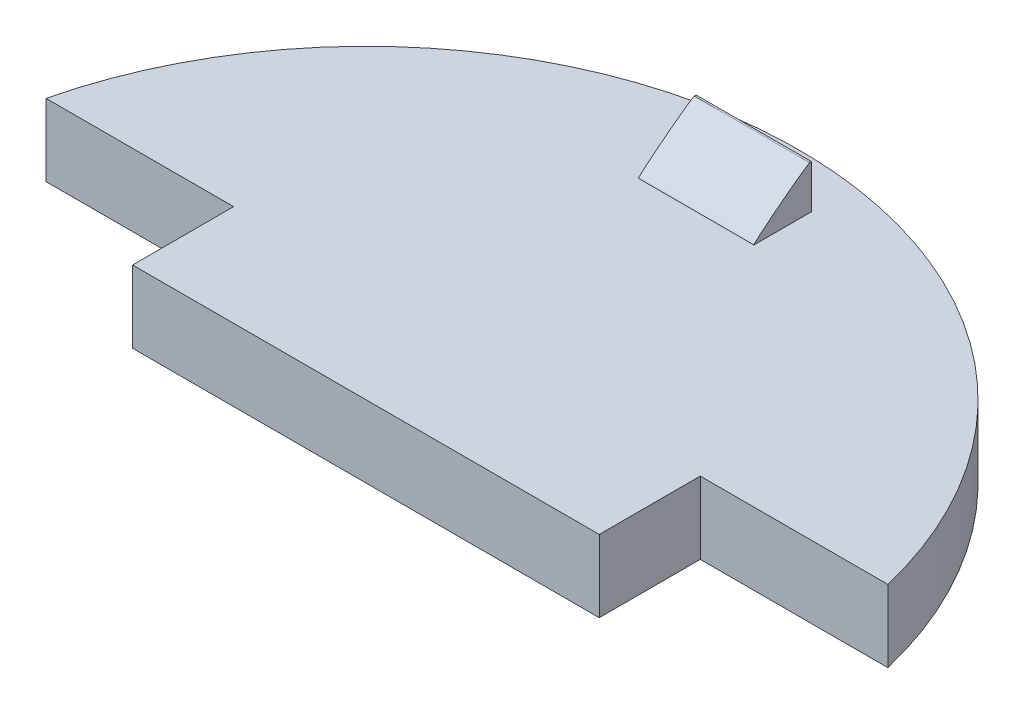
ISO-10303-21;
HEADER;
FILE_DESCRIPTION(('STEP AP214'),'2;1');
FILE_NAME('part.step','',(''),(''),'','','');
FILE_SCHEMA(('AUTOMOTIVE_DESIGN { 1 0 10303 214 1 1 1 1 }'));
ENDSEC;
DATA;
#1=APPLICATION_CONTEXT('core data for automotive mechanical design processes');
#2=APPLICATION_PROTOCOL_DEFINITION('international standard','automotive_design',2000,#1);
#3=PRODUCT_CONTEXT('',#1,'mechanical');
#4=PRODUCT('Part','Part','',(#3));
#5=PRODUCT_RELATED_PRODUCT_CATEGORY('part','',(#4));
#6=PRODUCT_DEFINITION_FORMATION('','',#4);
#7=PRODUCT_DEFINITION_CONTEXT('part definition',#1,'design');
#8=PRODUCT_DEFINITION('design','',#6,#7);
#9=PRODUCT_DEFINITION_SHAPE('','',#8);
#10=(LENGTH_UNIT() NAMED_UNIT(*) SI_UNIT(.MILLI.,.METRE.));
#11=(NAMED_UNIT(*) PLANE_ANGLE_UNIT() SI_UNIT($,.RADIAN.));
#12=(NAMED_UNIT(*) SI_UNIT($,.STERADIAN.) SOLID_ANGLE_UNIT());
#13=UNCERTAINTY_MEASURE_WITH_UNIT(LENGTH_MEASURE(1.E-05),#10,'distance_accuracy_value','');
#14=(GEOMETRIC_REPRESENTATION_CONTEXT(3) GLOBAL_UNCERTAINTY_ASSIGNED_CONTEXT((#13)) GLOBAL_UNIT_ASSIGNED_CONTEXT((#10,
#11,#12)) REPRESENTATION_CONTEXT('',''));
#15=CARTESIAN_POINT('',(0.,0.,0.));
#16=DIRECTION('',(0.,0.,1.));
#17=DIRECTION('',(1.,0.,0.));
#18=AXIS2_PLACEMENT_3D('',#15,#16,#17);
#19=CARTESIAN_POINT('',(0.,5.,0.));
#20=DIRECTION('',(0.,1.,0.));
#21=DIRECTION('',(0.,0.,1.));
#22=AXIS2_PLACEMENT_3D('',#19,#20,#21);
#23=PLANE('',#22);
#24=DIRECTION('',(-1.,0.,0.));
#25=VECTOR('',#24,1.);
#26=CARTESIAN_POINT('',(-16.1719042916297,5.,-7.));
#27=LINE('',#26,#25);
#28=CARTESIAN_POINT('',(-16.1719042916297,5.,-7.));
#29=VERTEX_POINT('',#28);
#30=CARTESIAN_POINT('',(-29.1719042916297,5.,-7.));
#31=VERTEX_POINT('',#30);
#32=EDGE_CURVE('E134',#29,#31,#27,.T.);
#33=ORIENTED_EDGE('',*,*,#32,.F.);
#34=DIRECTION('',(0.,0.,-1.));
#35=VECTOR('',#34,1.);
#36=CARTESIAN_POINT('',(-16.1719042916297,5.,0.));
#37=LINE('',#36,#35);
#38=CARTESIAN_POINT('',(-16.1719042916297,5.,0.));
#39=VERTEX_POINT('',#38);
#40=EDGE_CURVE('E126',#39,#29,#37,.T.);
#41=ORIENTED_EDGE('',*,*,#40,.F.);
#42=DIRECTION('',(1.,0.,0.));
#43=VECTOR('',#42,1.);
#44=CARTESIAN_POINT('',(-30.,5.,0.));
#45=LINE('',#44,#43);
#46=CARTESIAN_POINT('',(16.1719042916297,5.,0.));
#47=VERTEX_POINT('',#46);
#48=EDGE_CURVE('E140',#39,#47,#45,.T.);
#49=ORIENTED_EDGE('',*,*,#48,.T.);
#50=DIRECTION('',(0.,0.,1.));
#51=VECTOR('',#50,1.);
#52=CARTESIAN_POINT('',(16.1719042916297,5.,0.));
#53=LINE('',#52,#51);
#54=CARTESIAN_POINT('',(16.1719042916297,5.,-7.));
#55=VERTEX_POINT('',#54);
#56=EDGE_CURVE('E307',#55,#47,#53,.T.);
#57=ORIENTED_EDGE('',*,*,#56,.F.);
#58=DIRECTION('',(-1.,0.,0.));
#59=VECTOR('',#58,1.);
#60=CARTESIAN_POINT('',(16.1719042916297,5.,-7.));
#61=LINE('',#60,#59);
#62=CARTESIAN_POINT('',(29.1719042916297,5.,-7.));
#63=VERTEX_POINT('',#62);
#64=EDGE_CURVE('E304',#63,#55,#61,.T.);
#65=ORIENTED_EDGE('',*,*,#64,.F.);
#66=CARTESIAN_POINT('',(0.,5.,0.));
#67=DIRECTION('',(0.,1.,0.));
#68=DIRECTION('',(0.,0.,1.));
#69=AXIS2_PLACEMENT_3D('',#66,#67,#68);
#70=CIRCLE('',#69,30.);
#71=EDGE_CURVE('E149',#63,#31,#70,.T.);
#72=ORIENTED_EDGE('',*,*,#71,.T.);
#73=EDGE_LOOP('',(#33,#41,#49,#57,#65,#72));
#74=FACE_BOUND('',#73,.T.);
#75=DIRECTION('',(-1.,0.,0.));
#76=VECTOR('',#75,1.);
#77=CARTESIAN_POINT('',(-3.84159331598207,5.,-26.7316665793187));
#78=LINE('',#77,#76);
#79=CARTESIAN_POINT('',(4.15840668401793,5.,-26.7316665793187));
#80=VERTEX_POINT('',#79);
#81=CARTESIAN_POINT('',(-3.84159331598207,5.,-26.7316665793187));
#82=VERTEX_POINT('',#81);
#83=EDGE_CURVE('E183',#80,#82,#78,.T.);
#84=ORIENTED_EDGE('',*,*,#83,.F.);
#85=DIRECTION('',(0.,0.,-1.));
#86=VECTOR('',#85,1.);
#87=CARTESIAN_POINT('',(4.15840668401793,5.,-26.7316665793187));
#88=LINE('',#87,#86);
#89=CARTESIAN_POINT('',(4.15840668401793,5.,-22.7316665793187));
#90=VERTEX_POINT('',#89);
#91=EDGE_CURVE('E187',#90,#80,#88,.T.);
#92=ORIENTED_EDGE('',*,*,#91,.F.);
#93=CARTESIAN_POINT('',(-4.24159331598207,5.,-22.7316665793187));
#94=CARTESIAN_POINT('',(-1.30825998264874,5.,-22.7316665793187));
#95=CARTESIAN_POINT('',(1.6250733506846,5.,-22.7316665793187));
#96=CARTESIAN_POINT('',(4.55840668401793,5.,-22.7316665793187));
#97=(BOUNDED_CURVE() B_SPLINE_CURVE(3,(#93,#94,#95,#96),.UNSPECIFIED.,.F.,
.F.) B_SPLINE_CURVE_WITH_KNOTS((4,4),(-0.00455840668401793,0.00424159331598207),
.UNSPECIFIED.) CURVE() GEOMETRIC_REPRESENTATION_ITEM() RATIONAL_B_SPLINE_CURVE((1.,1.,1.,1.)) REPRESENTATION_ITEM(''));
#98=CARTESIAN_POINT('',(-3.84159331598207,5.,-22.7316665793187));
#99=VERTEX_POINT('',#98);
#100=EDGE_CURVE('E171',#99,#90,#97,.T.);
#101=ORIENTED_EDGE('',*,*,#100,.F.);
#102=DIRECTION('',(0.,0.,1.));
#103=VECTOR('',#102,1.);
#104=CARTESIAN_POINT('',(-3.84159331598207,5.,-26.7316665793187));
#105=LINE('',#104,#103);
#106=EDGE_CURVE('E186',#82,#99,#105,.T.);
#107=ORIENTED_EDGE('',*,*,#106,.F.);
#108=EDGE_LOOP('',(#84,#92,#101,#107));
#109=FACE_BOUND('',#108,.T.);
#110=ADVANCED_FACE('F43',(#74,#109),#23,.T.);
#111=CARTESIAN_POINT('',(0.,5.,0.));
#112=DIRECTION('',(0.,-1.,0.));
#113=DIRECTION('',(0.,0.,-1.));
#114=AXIS2_PLACEMENT_3D('',#111,#112,#113);
#115=CYLINDRICAL_SURFACE('',#114,30.);
#116=CARTESIAN_POINT('',(0.,0.,0.));
#117=DIRECTION('',(0.,1.,0.));
#118=DIRECTION('',(0.,0.,1.));
#119=AXIS2_PLACEMENT_3D('',#116,#117,#118);
#120=CIRCLE('',#119,30.);
#121=CARTESIAN_POINT('',(29.1719042916297,0.,-7.));
#122=VERTEX_POINT('',#121);
#123=CARTESIAN_POINT('',(-29.1719042916297,0.,-7.));
#124=VERTEX_POINT('',#123);
#125=EDGE_CURVE('E159',#122,#124,#120,.T.);
#126=ORIENTED_EDGE('',*,*,#125,.T.);
#127=DIRECTION('',(0.,1.,0.));
#128=VECTOR('',#127,1.);
#129=CARTESIAN_POINT('',(-29.1719042916297,-5.,-7.));
#130=LINE('',#129,#128);
#131=EDGE_CURVE('E207',#124,#31,#130,.T.);
#132=ORIENTED_EDGE('',*,*,#131,.T.);
#133=ORIENTED_EDGE('',*,*,#71,.F.);
#134=DIRECTION('',(0.,1.,0.));
#135=VECTOR('',#134,1.);
#136=CARTESIAN_POINT('',(29.1719042916297,-5.,-7.));
#137=LINE('',#136,#135);
#138=EDGE_CURVE('E178',#122,#63,#137,.T.);
#139=ORIENTED_EDGE('',*,*,#138,.F.);
#140=EDGE_LOOP('',(#126,#132,#133,#139));
#141=FACE_BOUND('',#140,.T.);
#142=ADVANCED_FACE('F278',(#141),#115,.T.);
#143=CARTESIAN_POINT('',(-30.,5.,0.));
#144=DIRECTION('',(0.,0.,-1.));
#145=DIRECTION('',(-1.,0.,0.));
#146=AXIS2_PLACEMENT_3D('',#143,#144,#145);
#147=PLANE('',#146);
#148=ORIENTED_EDGE('',*,*,#48,.F.);
#149=DIRECTION('',(0.,1.,0.));
#150=VECTOR('',#149,1.);
#151=CARTESIAN_POINT('',(-16.1719042916297,-5.,0.));
#152=LINE('',#151,#150);
#153=CARTESIAN_POINT('',(-16.1719042916297,0.,0.));
#154=VERTEX_POINT('',#153);
#155=EDGE_CURVE('E123',#154,#39,#152,.T.);
#156=ORIENTED_EDGE('',*,*,#155,.F.);
#157=DIRECTION('',(1.,0.,0.));
#158=VECTOR('',#157,1.);
#159=CARTESIAN_POINT('',(-30.,0.,0.));
#160=LINE('',#159,#158);
#161=CARTESIAN_POINT('',(16.1719042916297,0.,0.));
#162=VERTEX_POINT('',#161);
#163=EDGE_CURVE('E155',#154,#162,#160,.T.);
#164=ORIENTED_EDGE('',*,*,#163,.T.);
#165=DIRECTION('',(0.,1.,0.));
#166=VECTOR('',#165,1.);
#167=CARTESIAN_POINT('',(16.1719042916297,-5.,0.));
#168=LINE('',#167,#166);
#169=EDGE_CURVE('E143',#162,#47,#168,.T.);
#170=ORIENTED_EDGE('',*,*,#169,.T.);
#171=EDGE_LOOP('',(#148,#156,#164,#170));
#172=FACE_BOUND('',#171,.T.);
#173=ADVANCED_FACE('F146',(#172),#147,.F.);
#174=CARTESIAN_POINT('',(0.,0.,0.));
#175=DIRECTION('',(0.,1.,0.));
#176=DIRECTION('',(0.,0.,1.));
#177=AXIS2_PLACEMENT_3D('',#174,#175,#176);
#178=PLANE('',#177);
#179=DIRECTION('',(0.,0.,-1.));
#180=VECTOR('',#179,1.);
#181=CARTESIAN_POINT('',(-16.1719042916297,0.,0.));
#182=LINE('',#181,#180);
#183=CARTESIAN_POINT('',(-16.1719042916297,0.,-7.));
#184=VERTEX_POINT('',#183);
#185=EDGE_CURVE('E56',#154,#184,#182,.T.);
#186=ORIENTED_EDGE('',*,*,#185,.T.);
#187=DIRECTION('',(-1.,0.,0.));
#188=VECTOR('',#187,1.);
#189=CARTESIAN_POINT('',(0.,0.,-7.));
#190=LINE('',#189,#188);
#191=EDGE_CURVE('E12',#184,#124,#190,.T.);
#192=ORIENTED_EDGE('',*,*,#191,.T.);
#193=ORIENTED_EDGE('',*,*,#125,.F.);
#194=DIRECTION('',(-1.,0.,0.));
#195=VECTOR('',#194,1.);
#196=CARTESIAN_POINT('',(0.,0.,-7.));
#197=LINE('',#196,#195);
#198=CARTESIAN_POINT('',(16.1719042916297,0.,-7.));
#199=VERTEX_POINT('',#198);
#200=EDGE_CURVE('E267',#122,#199,#197,.T.);
#201=ORIENTED_EDGE('',*,*,#200,.T.);
#202=DIRECTION('',(0.,0.,1.));
#203=VECTOR('',#202,1.);
#204=CARTESIAN_POINT('',(16.1719042916297,0.,0.));
#205=LINE('',#204,#203);
#206=EDGE_CURVE('E317',#199,#162,#205,.T.);
#207=ORIENTED_EDGE('',*,*,#206,.T.);
#208=ORIENTED_EDGE('',*,*,#163,.F.);
#209=EDGE_LOOP('',(#186,#192,#193,#201,#207,#208));
#210=FACE_BOUND('',#209,.T.);
#211=ADVANCED_FACE('F281',(#210),#178,.F.);
#212=CARTESIAN_POINT('',(4.15840668401793,8.,-26.7316665793187));
#213=DIRECTION('',(-1.,0.,0.));
#214=DIRECTION('',(0.,0.,1.));
#215=AXIS2_PLACEMENT_3D('',#212,#213,#214);
#216=PLANE('',#215);
#217=DIRECTION('',(0.,0.,-1.));
#218=VECTOR('',#217,1.);
#219=CARTESIAN_POINT('',(4.15840668401793,8.,-26.7316665793187));
#220=LINE('',#219,#218);
#221=CARTESIAN_POINT('',(4.15840668401793,8.,-26.6046499255261));
#222=VERTEX_POINT('',#221);
#223=CARTESIAN_POINT('',(4.15840668401793,8.,-26.7316665793187));
#224=VERTEX_POINT('',#223);
#225=EDGE_CURVE('E166',#222,#224,#220,.T.);
#226=ORIENTED_EDGE('',*,*,#225,.F.);
#227=CARTESIAN_POINT('',(4.15840668401793,5.,-22.7316665793187));
#228=CARTESIAN_POINT('',(4.15840668401793,8.,-23.5062632485602));
#229=CARTESIAN_POINT('',(4.15840668401793,8.,-26.6046499255261));
#230=(BOUNDED_CURVE() B_SPLINE_CURVE(2,(#227,#228,#229),.UNSPECIFIED.,.F.,
.F.) B_SPLINE_CURVE_WITH_KNOTS((3,3),(0.,1.),
.UNSPECIFIED.) CURVE() GEOMETRIC_REPRESENTATION_ITEM() RATIONAL_B_SPLINE_CURVE((1.,
0.0574959574576069,1.)) REPRESENTATION_ITEM(''));
#231=EDGE_CURVE('E154',#222,#90,#230,.F.);
#232=ORIENTED_EDGE('',*,*,#231,.T.);
#233=ORIENTED_EDGE('',*,*,#91,.T.);
#234=DIRECTION('',(0.,-1.,0.));
#235=VECTOR('',#234,1.);
#236=CARTESIAN_POINT('',(4.15840668401793,8.,-26.7316665793187));
#237=LINE('',#236,#235);
#238=EDGE_CURVE('E163',#224,#80,#237,.T.);
#239=ORIENTED_EDGE('',*,*,#238,.F.);
#240=EDGE_LOOP('',(#226,#232,#233,#239));
#241=FACE_BOUND('',#240,.T.);
#242=ADVANCED_FACE('F202',(#241),#216,.F.);
#243=CARTESIAN_POINT('',(-3.84159331598207,8.,-26.7316665793187));
#244=DIRECTION('',(0.,0.,1.));
#245=DIRECTION('',(1.,0.,0.));
#246=AXIS2_PLACEMENT_3D('',#243,#244,#245);
#247=PLANE('',#246);
#248=ORIENTED_EDGE('',*,*,#83,.T.);
#249=DIRECTION('',(0.,-1.,0.));
#250=VECTOR('',#249,1.);
#251=CARTESIAN_POINT('',(-3.84159331598207,8.,-26.7316665793187));
#252=LINE('',#251,#250);
#253=CARTESIAN_POINT('',(-3.84159331598207,8.,-26.7316665793187));
#254=VERTEX_POINT('',#253);
#255=EDGE_CURVE('E188',#254,#82,#252,.T.);
#256=ORIENTED_EDGE('',*,*,#255,.F.);
#257=DIRECTION('',(-1.,0.,0.));
#258=VECTOR('',#257,1.);
#259=CARTESIAN_POINT('',(-3.84159331598207,8.,-26.7316665793187));
#260=LINE('',#259,#258);
#261=EDGE_CURVE('E170',#224,#254,#260,.T.);
#262=ORIENTED_EDGE('',*,*,#261,.F.);
#263=ORIENTED_EDGE('',*,*,#238,.T.);
#264=EDGE_LOOP('',(#248,#256,#262,#263));
#265=FACE_BOUND('',#264,.T.);
#266=ADVANCED_FACE('F196',(#265),#247,.F.);
#267=CARTESIAN_POINT('',(-3.84159331598207,8.,-26.7316665793187));
#268=DIRECTION('',(1.,0.,0.));
#269=DIRECTION('',(0.,0.,-1.));
#270=AXIS2_PLACEMENT_3D('',#267,#268,#269);
#271=PLANE('',#270);
#272=ORIENTED_EDGE('',*,*,#106,.T.);
#273=CARTESIAN_POINT('',(-3.84159331598207,8.,-26.6046499255261));
#274=CARTESIAN_POINT('',(-3.84159331598207,8.,-23.5062632485602));
#275=CARTESIAN_POINT('',(-3.84159331598207,5.,-22.7316665793187));
#276=(BOUNDED_CURVE() B_SPLINE_CURVE(2,(#273,#274,#275),.UNSPECIFIED.,.F.,
.F.) B_SPLINE_CURVE_WITH_KNOTS((3,3),(0.,1.),
.UNSPECIFIED.) CURVE() GEOMETRIC_REPRESENTATION_ITEM() RATIONAL_B_SPLINE_CURVE((1.,
0.0574959574576069,1.)) REPRESENTATION_ITEM(''));
#277=CARTESIAN_POINT('',(-3.84159331598207,8.,-26.6046499255261));
#278=VERTEX_POINT('',#277);
#279=EDGE_CURVE('E245',#99,#278,#276,.F.);
#280=ORIENTED_EDGE('',*,*,#279,.T.);
#281=DIRECTION('',(0.,0.,1.));
#282=VECTOR('',#281,1.);
#283=CARTESIAN_POINT('',(-3.84159331598207,8.,-26.7316665793187));
#284=LINE('',#283,#282);
#285=EDGE_CURVE('E172',#254,#278,#284,.T.);
#286=ORIENTED_EDGE('',*,*,#285,.F.);
#287=ORIENTED_EDGE('',*,*,#255,.T.);
#288=EDGE_LOOP('',(#272,#280,#286,#287));
#289=FACE_BOUND('',#288,.T.);
#290=ADVANCED_FACE('F325',(#289),#271,.F.);
#291=CARTESIAN_POINT('',(0.,8.,0.));
#292=DIRECTION('',(0.,1.,0.));
#293=DIRECTION('',(0.,0.,1.));
#294=AXIS2_PLACEMENT_3D('',#291,#292,#293);
#295=PLANE('',#294);
#296=ORIENTED_EDGE('',*,*,#285,.T.);
#297=CARTESIAN_POINT('',(4.55840668401793,8.,-26.6046499255261));
#298=CARTESIAN_POINT('',(1.6250733506846,8.,-26.6046499255261));
#299=CARTESIAN_POINT('',(-1.30825998264874,8.,-26.6046499255261));
#300=CARTESIAN_POINT('',(-4.24159331598207,8.,-26.6046499255261));
#301=(BOUNDED_CURVE() B_SPLINE_CURVE(3,(#297,#298,#299,#300),.UNSPECIFIED.,.F.,
.F.) B_SPLINE_CURVE_WITH_KNOTS((4,4),(-0.00455840668401793,0.00424159331598207),
.UNSPECIFIED.) CURVE() GEOMETRIC_REPRESENTATION_ITEM() RATIONAL_B_SPLINE_CURVE((1.,1.,1.,1.)) REPRESENTATION_ITEM(''));
#302=EDGE_CURVE('E148',#278,#222,#301,.F.);
#303=ORIENTED_EDGE('',*,*,#302,.T.);
#304=ORIENTED_EDGE('',*,*,#225,.T.);
#305=ORIENTED_EDGE('',*,*,#261,.T.);
#306=EDGE_LOOP('',(#296,#303,#304,#305));
#307=FACE_BOUND('',#306,.T.);
#308=ADVANCED_FACE('F328',(#307),#295,.T.);
#309=CARTESIAN_POINT('',(4.55840668401793,5.,-22.7316665793187));
#310=CARTESIAN_POINT('',(1.6250733506846,5.,-22.7316665793187));
#311=CARTESIAN_POINT('',(-1.30825998264874,5.,-22.7316665793187));
#312=CARTESIAN_POINT('',(-4.24159331598207,5.,-22.7316665793187));
#313=CARTESIAN_POINT('',(4.55840668401793,8.,-23.5062632485602));
#314=CARTESIAN_POINT('',(1.6250733506846,8.,-23.5062632485602));
#315=CARTESIAN_POINT('',(-1.30825998264874,8.,-23.5062632485602));
#316=CARTESIAN_POINT('',(-4.24159331598207,8.,-23.5062632485602));
#317=CARTESIAN_POINT('',(4.55840668401793,8.,-26.6046499255261));
#318=CARTESIAN_POINT('',(1.6250733506846,8.,-26.6046499255261));
#319=CARTESIAN_POINT('',(-1.30825998264874,8.,-26.6046499255261));
#320=CARTESIAN_POINT('',(-4.24159331598207,8.,-26.6046499255261));
#321=(BOUNDED_SURFACE() B_SPLINE_SURFACE(2,3,((#309,#310,#311,#312),(#313,#314,#315,#316),(#317,
#318,#319,#320)),.UNSPECIFIED.,.F.,.F.,.F.) B_SPLINE_SURFACE_WITH_KNOTS((3,3),(4,4),(0.,1.),
(-0.00455840668401793,0.00424159331598207),
.UNSPECIFIED.) GEOMETRIC_REPRESENTATION_ITEM() RATIONAL_B_SPLINE_SURFACE(((1.,1.,1.,1.),
(0.0574959574576069,0.0574959574576069,0.0574959574576069,0.0574959574576069),(1.,1.,1.,1.))) REPRESENTATION_ITEM('') SURFACE());
#322=ORIENTED_EDGE('',*,*,#279,.F.);
#323=ORIENTED_EDGE('',*,*,#100,.T.);
#324=ORIENTED_EDGE('',*,*,#231,.F.);
#325=ORIENTED_EDGE('',*,*,#302,.F.);
#326=EDGE_LOOP('',(#322,#323,#324,#325));
#327=FACE_BOUND('',#326,.T.);
#328=ADVANCED_FACE('F46',(#327),#321,.T.);
#329=CARTESIAN_POINT('',(16.1719042916297,-5.,0.));
#330=DIRECTION('',(-1.,0.,0.));
#331=DIRECTION('',(0.,0.,1.));
#332=AXIS2_PLACEMENT_3D('',#329,#330,#331);
#333=PLANE('',#332);
#334=DIRECTION('',(0.,1.,0.));
#335=VECTOR('',#334,1.);
#336=CARTESIAN_POINT('',(16.1719042916297,-5.,-7.));
#337=LINE('',#336,#335);
#338=EDGE_CURVE('E71',#199,#55,#337,.T.);
#339=ORIENTED_EDGE('',*,*,#338,.T.);
#340=ORIENTED_EDGE('',*,*,#56,.T.);
#341=ORIENTED_EDGE('',*,*,#169,.F.);
#342=ORIENTED_EDGE('',*,*,#206,.F.);
#343=EDGE_LOOP('',(#339,#340,#341,#342));
#344=FACE_BOUND('',#343,.T.);
#345=ADVANCED_FACE('F316',(#344),#333,.F.);
#346=CARTESIAN_POINT('',(16.1719042916297,-5.,-7.));
#347=DIRECTION('',(0.,0.,-1.));
#348=DIRECTION('',(-1.,0.,0.));
#349=AXIS2_PLACEMENT_3D('',#346,#347,#348);
#350=PLANE('',#349);
#351=ORIENTED_EDGE('',*,*,#138,.T.);
#352=ORIENTED_EDGE('',*,*,#64,.T.);
#353=ORIENTED_EDGE('',*,*,#338,.F.);
#354=ORIENTED_EDGE('',*,*,#200,.F.);
#355=EDGE_LOOP('',(#351,#352,#353,#354));
#356=FACE_BOUND('',#355,.T.);
#357=ADVANCED_FACE('F315',(#356),#350,.F.);
#358=CARTESIAN_POINT('',(-16.1719042916297,-5.,-7.));
#359=DIRECTION('',(0.,0.,-1.));
#360=DIRECTION('',(-1.,0.,0.));
#361=AXIS2_PLACEMENT_3D('',#358,#359,#360);
#362=PLANE('',#361);
#363=DIRECTION('',(0.,1.,0.));
#364=VECTOR('',#363,1.);
#365=CARTESIAN_POINT('',(-16.1719042916297,-5.,-7.));
#366=LINE('',#365,#364);
#367=EDGE_CURVE('E63',#184,#29,#366,.T.);
#368=ORIENTED_EDGE('',*,*,#367,.T.);
#369=ORIENTED_EDGE('',*,*,#32,.T.);
#370=ORIENTED_EDGE('',*,*,#131,.F.);
#371=ORIENTED_EDGE('',*,*,#191,.F.);
#372=EDGE_LOOP('',(#368,#369,#370,#371));
#373=FACE_BOUND('',#372,.T.);
#374=ADVANCED_FACE('F297',(#373),#362,.F.);
#375=CARTESIAN_POINT('',(-16.1719042916297,-5.,0.));
#376=DIRECTION('',(1.,0.,0.));
#377=DIRECTION('',(0.,0.,-1.));
#378=AXIS2_PLACEMENT_3D('',#375,#376,#377);
#379=PLANE('',#378);
#380=ORIENTED_EDGE('',*,*,#155,.T.);
#381=ORIENTED_EDGE('',*,*,#40,.T.);
#382=ORIENTED_EDGE('',*,*,#367,.F.);
#383=ORIENTED_EDGE('',*,*,#185,.F.);
#384=EDGE_LOOP('',(#380,#381,#382,#383));
#385=FACE_BOUND('',#384,.T.);
#386=ADVANCED_FACE('F125',(#385),#379,.F.);
#387=CLOSED_SHELL('',(#110,#142,#173,#211,#242,#266,#290,#308,#328,#345,#357,#374,#386));
#388=MANIFOLD_SOLID_BREP('B2',#387);
#389=ADVANCED_BREP_SHAPE_REPRESENTATION('',(#18,#388),#14);
#390=SHAPE_DEFINITION_REPRESENTATION(#9,#389);
ENDSEC;
END-ISO-10303-21;
